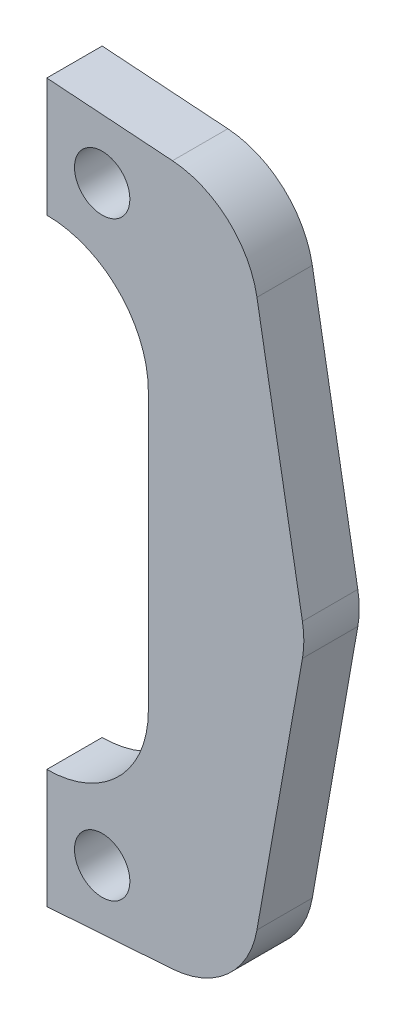
ISO-10303-21;
HEADER;
FILE_DESCRIPTION(('STEP AP214'),'2;1');
FILE_NAME('part.step','',(''),(''),'','','');
FILE_SCHEMA(('AUTOMOTIVE_DESIGN { 1 0 10303 214 1 1 1 1 }'));
ENDSEC;
DATA;
#1=APPLICATION_CONTEXT('core data for automotive mechanical design processes');
#2=APPLICATION_PROTOCOL_DEFINITION('international standard','automotive_design',2000,#1);
#3=PRODUCT_CONTEXT('',#1,'mechanical');
#4=PRODUCT('Part','Part','',(#3));
#5=PRODUCT_RELATED_PRODUCT_CATEGORY('part','',(#4));
#6=PRODUCT_DEFINITION_FORMATION('','',#4);
#7=PRODUCT_DEFINITION_CONTEXT('part definition',#1,'design');
#8=PRODUCT_DEFINITION('design','',#6,#7);
#9=PRODUCT_DEFINITION_SHAPE('','',#8);
#10=(LENGTH_UNIT() NAMED_UNIT(*) SI_UNIT(.MILLI.,.METRE.));
#11=(NAMED_UNIT(*) PLANE_ANGLE_UNIT() SI_UNIT($,.RADIAN.));
#12=(NAMED_UNIT(*) SI_UNIT($,.STERADIAN.) SOLID_ANGLE_UNIT());
#13=UNCERTAINTY_MEASURE_WITH_UNIT(LENGTH_MEASURE(1.E-05),#10,'distance_accuracy_value','');
#14=(GEOMETRIC_REPRESENTATION_CONTEXT(3) GLOBAL_UNCERTAINTY_ASSIGNED_CONTEXT((#13)) GLOBAL_UNIT_ASSIGNED_CONTEXT((#10,
#11,#12)) REPRESENTATION_CONTEXT('',''));
#15=CARTESIAN_POINT('',(0.,0.,0.));
#16=DIRECTION('',(0.,0.,1.));
#17=DIRECTION('',(1.,0.,0.));
#18=AXIS2_PLACEMENT_3D('',#15,#16,#17);
#19=CARTESIAN_POINT('',(89.2258605561517,15.7329265929809,3.));
#20=DIRECTION('',(-0.984807753012208,-0.173648177666932,0.));
#21=DIRECTION('',(0.173648177666932,-0.984807753012208,0.));
#22=AXIS2_PLACEMENT_3D('',#19,#20,#21);
#23=PLANE('',#22);
#24=DIRECTION('',(-0.173648177666932,0.984807753012208,0.));
#25=VECTOR('',#24,1.);
#26=CARTESIAN_POINT('',(89.2258605561517,15.7329265929809,0.));
#27=LINE('',#26,#25);
#28=CARTESIAN_POINT('',(91.8469057056323,0.868240888334657,0.));
#29=VERTEX_POINT('',#28);
#30=CARTESIAN_POINT('',(89.3836489681068,14.8380640409134,0.));
#31=VERTEX_POINT('',#30);
#32=EDGE_CURVE('E160',#29,#31,#27,.T.);
#33=ORIENTED_EDGE('',*,*,#32,.T.);
#34=DIRECTION('',(0.,0.,-1.));
#35=VECTOR('',#34,1.);
#36=CARTESIAN_POINT('',(89.3836489681068,14.8380640409134,3.));
#37=LINE('',#36,#35);
#38=CARTESIAN_POINT('',(89.3836489681068,14.8380640409134,3.));
#39=VERTEX_POINT('',#38);
#40=EDGE_CURVE('E11',#39,#31,#37,.T.);
#41=ORIENTED_EDGE('',*,*,#40,.F.);
#42=DIRECTION('',(-0.173648177666932,0.984807753012208,0.));
#43=VECTOR('',#42,1.);
#44=CARTESIAN_POINT('',(89.2258605561517,15.7329265929809,3.));
#45=LINE('',#44,#43);
#46=CARTESIAN_POINT('',(91.8469057056323,0.868240888334657,3.));
#47=VERTEX_POINT('',#46);
#48=EDGE_CURVE('E253',#47,#39,#45,.T.);
#49=ORIENTED_EDGE('',*,*,#48,.F.);
#50=DIRECTION('',(0.,0.,-1.));
#51=VECTOR('',#50,1.);
#52=CARTESIAN_POINT('',(91.8469057056323,0.868240888334657,3.));
#53=LINE('',#52,#51);
#54=EDGE_CURVE('E150',#47,#29,#53,.T.);
#55=ORIENTED_EDGE('',*,*,#54,.T.);
#56=EDGE_LOOP('',(#33,#41,#49,#55));
#57=FACE_BOUND('',#56,.T.);
#58=ADVANCED_FACE('F33',(#57),#23,.F.);
#59=CARTESIAN_POINT('',(84.4596102030458,13.9698231525787,3.));
#60=DIRECTION('',(0.,0.,-1.));
#61=DIRECTION('',(-1.,0.,0.));
#62=AXIS2_PLACEMENT_3D('',#59,#60,#61);
#63=CYLINDRICAL_SURFACE('',#62,5.);
#64=CARTESIAN_POINT('',(84.4596102030458,13.9698231525787,0.));
#65=DIRECTION('',(0.,0.,1.));
#66=DIRECTION('',(1.,0.,0.));
#67=AXIS2_PLACEMENT_3D('',#64,#65,#66);
#68=CIRCLE('',#67,5.);
#69=CARTESIAN_POINT('',(84.8083925717664,18.9576434038778,0.));
#70=VERTEX_POINT('',#69);
#71=EDGE_CURVE('E163',#31,#70,#68,.T.);
#72=ORIENTED_EDGE('',*,*,#71,.T.);
#73=DIRECTION('',(0.,0.,-1.));
#74=VECTOR('',#73,1.);
#75=CARTESIAN_POINT('',(84.8083925717664,18.9576434038778,3.));
#76=LINE('',#75,#74);
#77=CARTESIAN_POINT('',(84.8083925717664,18.9576434038778,3.));
#78=VERTEX_POINT('',#77);
#79=EDGE_CURVE('E42',#78,#70,#76,.T.);
#80=ORIENTED_EDGE('',*,*,#79,.F.);
#81=CARTESIAN_POINT('',(84.4596102030458,13.9698231525787,3.));
#82=DIRECTION('',(0.,0.,1.));
#83=DIRECTION('',(1.,0.,0.));
#84=AXIS2_PLACEMENT_3D('',#81,#82,#83);
#85=CIRCLE('',#84,5.);
#86=EDGE_CURVE('E105',#39,#78,#85,.T.);
#87=ORIENTED_EDGE('',*,*,#86,.F.);
#88=ORIENTED_EDGE('',*,*,#40,.T.);
#89=EDGE_LOOP('',(#72,#80,#87,#88));
#90=FACE_BOUND('',#89,.T.);
#91=ADVANCED_FACE('F268',(#90),#63,.T.);
#92=CARTESIAN_POINT('',(1.73187173302938,24.7669196534888,3.));
#93=DIRECTION('',(-0.0697564737441186,-0.997564050259825,0.));
#94=DIRECTION('',(0.997564050259825,-0.0697564737441186,0.));
#95=AXIS2_PLACEMENT_3D('',#92,#93,#94);
#96=PLANE('',#95);
#97=DIRECTION('',(-0.997564050259825,0.0697564737441186,0.));
#98=VECTOR('',#97,1.);
#99=CARTESIAN_POINT('',(1.73187173302938,24.7669196534888,0.));
#100=LINE('',#99,#98);
#101=CARTESIAN_POINT('',(78.,19.4337325908813,0.));
#102=VERTEX_POINT('',#101);
#103=EDGE_CURVE('E165',#70,#102,#100,.T.);
#104=ORIENTED_EDGE('',*,*,#103,.T.);
#105=DIRECTION('',(0.,0.,-1.));
#106=VECTOR('',#105,1.);
#107=CARTESIAN_POINT('',(78.,19.4337325908813,3.));
#108=LINE('',#107,#106);
#109=CARTESIAN_POINT('',(78.,19.4337325908813,3.));
#110=VERTEX_POINT('',#109);
#111=EDGE_CURVE('E200',#110,#102,#108,.T.);
#112=ORIENTED_EDGE('',*,*,#111,.F.);
#113=DIRECTION('',(-0.997564050259825,0.0697564737441186,0.));
#114=VECTOR('',#113,1.);
#115=CARTESIAN_POINT('',(1.73187173302938,24.7669196534888,3.));
#116=LINE('',#115,#114);
#117=EDGE_CURVE('E208',#78,#110,#116,.T.);
#118=ORIENTED_EDGE('',*,*,#117,.F.);
#119=ORIENTED_EDGE('',*,*,#79,.T.);
#120=EDGE_LOOP('',(#104,#112,#118,#119));
#121=FACE_BOUND('',#120,.T.);
#122=ADVANCED_FACE('F206',(#121),#96,.F.);
#123=CARTESIAN_POINT('',(78.,0.,3.));
#124=DIRECTION('',(1.,0.,0.));
#125=DIRECTION('',(0.,1.,0.));
#126=AXIS2_PLACEMENT_3D('',#123,#124,#125);
#127=PLANE('',#126);
#128=DIRECTION('',(0.,-1.,0.));
#129=VECTOR('',#128,1.);
#130=CARTESIAN_POINT('',(78.,0.,0.));
#131=LINE('',#130,#129);
#132=CARTESIAN_POINT('',(78.,13.,0.));
#133=VERTEX_POINT('',#132);
#134=EDGE_CURVE('E167',#102,#133,#131,.T.);
#135=ORIENTED_EDGE('',*,*,#134,.T.);
#136=DIRECTION('',(0.,0.,-1.));
#137=VECTOR('',#136,1.);
#138=CARTESIAN_POINT('',(78.,13.,3.));
#139=LINE('',#138,#137);
#140=CARTESIAN_POINT('',(78.,13.,3.));
#141=VERTEX_POINT('',#140);
#142=EDGE_CURVE('E198',#141,#133,#139,.T.);
#143=ORIENTED_EDGE('',*,*,#142,.F.);
#144=DIRECTION('',(0.,-1.,0.));
#145=VECTOR('',#144,1.);
#146=CARTESIAN_POINT('',(78.,0.,3.));
#147=LINE('',#146,#145);
#148=EDGE_CURVE('E219',#110,#141,#147,.T.);
#149=ORIENTED_EDGE('',*,*,#148,.F.);
#150=ORIENTED_EDGE('',*,*,#111,.T.);
#151=EDGE_LOOP('',(#135,#143,#149,#150));
#152=FACE_BOUND('',#151,.T.);
#153=ADVANCED_FACE('F216',(#152),#127,.F.);
#154=CARTESIAN_POINT('',(78.,7.5,3.));
#155=DIRECTION('',(0.,0.,-1.));
#156=DIRECTION('',(-1.,0.,0.));
#157=AXIS2_PLACEMENT_3D('',#154,#155,#156);
#158=CYLINDRICAL_SURFACE('',#157,5.50000000000001);
#159=CARTESIAN_POINT('',(78.,7.5,0.));
#160=DIRECTION('',(0.,0.,1.));
#161=DIRECTION('',(1.,0.,0.));
#162=AXIS2_PLACEMENT_3D('',#159,#160,#161);
#163=CIRCLE('',#162,5.50000000000001);
#164=CARTESIAN_POINT('',(83.5,7.5,0.));
#165=VERTEX_POINT('',#164);
#166=EDGE_CURVE('E170',#165,#133,#163,.T.);
#167=ORIENTED_EDGE('',*,*,#166,.F.);
#168=DIRECTION('',(0.,0.,-1.));
#169=VECTOR('',#168,1.);
#170=CARTESIAN_POINT('',(83.5,7.5,3.));
#171=LINE('',#170,#169);
#172=CARTESIAN_POINT('',(83.5,7.5,3.));
#173=VERTEX_POINT('',#172);
#174=EDGE_CURVE('E196',#173,#165,#171,.T.);
#175=ORIENTED_EDGE('',*,*,#174,.F.);
#176=CARTESIAN_POINT('',(78.,7.5,3.));
#177=DIRECTION('',(0.,0.,1.));
#178=DIRECTION('',(1.,0.,0.));
#179=AXIS2_PLACEMENT_3D('',#176,#177,#178);
#180=CIRCLE('',#179,5.50000000000001);
#181=EDGE_CURVE('E221',#173,#141,#180,.T.);
#182=ORIENTED_EDGE('',*,*,#181,.T.);
#183=ORIENTED_EDGE('',*,*,#142,.T.);
#184=EDGE_LOOP('',(#167,#175,#182,#183));
#185=FACE_BOUND('',#184,.T.);
#186=ADVANCED_FACE('F241',(#185),#158,.F.);
#187=CARTESIAN_POINT('',(83.5,0.,3.));
#188=DIRECTION('',(-1.,0.,0.));
#189=DIRECTION('',(0.,0.,1.));
#190=AXIS2_PLACEMENT_3D('',#187,#188,#189);
#191=PLANE('',#190);
#192=DIRECTION('',(0.,1.,0.));
#193=VECTOR('',#192,1.);
#194=CARTESIAN_POINT('',(83.5,0.,0.));
#195=LINE('',#194,#193);
#196=CARTESIAN_POINT('',(83.5,-7.5,0.));
#197=VERTEX_POINT('',#196);
#198=EDGE_CURVE('E174',#197,#165,#195,.T.);
#199=ORIENTED_EDGE('',*,*,#198,.F.);
#200=DIRECTION('',(0.,0.,-1.));
#201=VECTOR('',#200,1.);
#202=CARTESIAN_POINT('',(83.5,-7.5,3.));
#203=LINE('',#202,#201);
#204=CARTESIAN_POINT('',(83.5,-7.5,3.));
#205=VERTEX_POINT('',#204);
#206=EDGE_CURVE('E194',#205,#197,#203,.T.);
#207=ORIENTED_EDGE('',*,*,#206,.F.);
#208=DIRECTION('',(0.,1.,0.));
#209=VECTOR('',#208,1.);
#210=CARTESIAN_POINT('',(83.5,0.,3.));
#211=LINE('',#210,#209);
#212=EDGE_CURVE('E224',#205,#173,#211,.T.);
#213=ORIENTED_EDGE('',*,*,#212,.T.);
#214=ORIENTED_EDGE('',*,*,#174,.T.);
#215=EDGE_LOOP('',(#199,#207,#213,#214));
#216=FACE_BOUND('',#215,.T.);
#217=ADVANCED_FACE('F239',(#216),#191,.T.);
#218=CARTESIAN_POINT('',(78.,-7.5,3.));
#219=DIRECTION('',(0.,0.,-1.));
#220=DIRECTION('',(-1.,0.,0.));
#221=AXIS2_PLACEMENT_3D('',#218,#219,#220);
#222=CYLINDRICAL_SURFACE('',#221,5.50000000000001);
#223=CARTESIAN_POINT('',(78.,-7.5,0.));
#224=DIRECTION('',(0.,0.,1.));
#225=DIRECTION('',(1.,0.,0.));
#226=AXIS2_PLACEMENT_3D('',#223,#224,#225);
#227=CIRCLE('',#226,5.50000000000001);
#228=CARTESIAN_POINT('',(78.,-13.,0.));
#229=VERTEX_POINT('',#228);
#230=EDGE_CURVE('E177',#229,#197,#227,.T.);
#231=ORIENTED_EDGE('',*,*,#230,.F.);
#232=DIRECTION('',(0.,0.,-1.));
#233=VECTOR('',#232,1.);
#234=CARTESIAN_POINT('',(78.,-13.,3.));
#235=LINE('',#234,#233);
#236=CARTESIAN_POINT('',(78.,-13.,3.));
#237=VERTEX_POINT('',#236);
#238=EDGE_CURVE('E192',#237,#229,#235,.T.);
#239=ORIENTED_EDGE('',*,*,#238,.F.);
#240=CARTESIAN_POINT('',(78.,-7.5,3.));
#241=DIRECTION('',(0.,0.,1.));
#242=DIRECTION('',(1.,0.,0.));
#243=AXIS2_PLACEMENT_3D('',#240,#241,#242);
#244=CIRCLE('',#243,5.50000000000001);
#245=EDGE_CURVE('E227',#237,#205,#244,.T.);
#246=ORIENTED_EDGE('',*,*,#245,.T.);
#247=ORIENTED_EDGE('',*,*,#206,.T.);
#248=EDGE_LOOP('',(#231,#239,#246,#247));
#249=FACE_BOUND('',#248,.T.);
#250=ADVANCED_FACE('F245',(#249),#222,.F.);
#251=CARTESIAN_POINT('',(78.,-19.4337325908813,0.));
#252=VERTEX_POINT('',#251);
#253=EDGE_CURVE('E171',#229,#252,#131,.T.);
#254=ORIENTED_EDGE('',*,*,#253,.T.);
#255=DIRECTION('',(0.,0.,-1.));
#256=VECTOR('',#255,1.);
#257=CARTESIAN_POINT('',(78.,-19.4337325908813,3.));
#258=LINE('',#257,#256);
#259=CARTESIAN_POINT('',(78.,-19.4337325908813,3.));
#260=VERTEX_POINT('',#259);
#261=EDGE_CURVE('E189',#260,#252,#258,.T.);
#262=ORIENTED_EDGE('',*,*,#261,.F.);
#263=EDGE_CURVE('E223',#237,#260,#147,.T.);
#264=ORIENTED_EDGE('',*,*,#263,.F.);
#265=ORIENTED_EDGE('',*,*,#238,.T.);
#266=EDGE_LOOP('',(#254,#262,#264,#265));
#267=FACE_BOUND('',#266,.T.);
#268=ADVANCED_FACE('F247',(#267),#127,.F.);
#269=CARTESIAN_POINT('',(1.73187173302938,-24.7669196534888,3.));
#270=DIRECTION('',(-0.0697564737441189,0.997564050259825,0.));
#271=DIRECTION('',(-0.997564050259825,-0.0697564737441189,0.));
#272=AXIS2_PLACEMENT_3D('',#269,#270,#271);
#273=PLANE('',#272);
#274=DIRECTION('',(0.997564050259825,0.0697564737441189,0.));
#275=VECTOR('',#274,1.);
#276=CARTESIAN_POINT('',(1.73187173302938,-24.7669196534888,0.));
#277=LINE('',#276,#275);
#278=CARTESIAN_POINT('',(84.8083925717664,-18.9576434038778,0.));
#279=VERTEX_POINT('',#278);
#280=EDGE_CURVE('E180',#252,#279,#277,.T.);
#281=ORIENTED_EDGE('',*,*,#280,.T.);
#282=DIRECTION('',(0.,0.,-1.));
#283=VECTOR('',#282,1.);
#284=CARTESIAN_POINT('',(84.8083925717664,-18.9576434038778,3.));
#285=LINE('',#284,#283);
#286=CARTESIAN_POINT('',(84.8083925717664,-18.9576434038778,3.));
#287=VERTEX_POINT('',#286);
#288=EDGE_CURVE('E145',#287,#279,#285,.T.);
#289=ORIENTED_EDGE('',*,*,#288,.F.);
#290=DIRECTION('',(0.997564050259825,0.0697564737441189,0.));
#291=VECTOR('',#290,1.);
#292=CARTESIAN_POINT('',(1.73187173302938,-24.7669196534888,3.));
#293=LINE('',#292,#291);
#294=EDGE_CURVE('E136',#260,#287,#293,.T.);
#295=ORIENTED_EDGE('',*,*,#294,.F.);
#296=ORIENTED_EDGE('',*,*,#261,.T.);
#297=EDGE_LOOP('',(#281,#289,#295,#296));
#298=FACE_BOUND('',#297,.T.);
#299=ADVANCED_FACE('F249',(#298),#273,.F.);
#300=CARTESIAN_POINT('',(84.4596102030458,-13.9698231525787,3.));
#301=DIRECTION('',(0.,0.,-1.));
#302=DIRECTION('',(-1.,0.,0.));
#303=AXIS2_PLACEMENT_3D('',#300,#301,#302);
#304=CYLINDRICAL_SURFACE('',#303,4.99999999999999);
#305=CARTESIAN_POINT('',(84.4596102030458,-13.9698231525787,0.));
#306=DIRECTION('',(0.,0.,1.));
#307=DIRECTION('',(1.,0.,0.));
#308=AXIS2_PLACEMENT_3D('',#305,#306,#307);
#309=CIRCLE('',#308,4.99999999999999);
#310=CARTESIAN_POINT('',(89.3836489681068,-14.8380640409134,0.));
#311=VERTEX_POINT('',#310);
#312=EDGE_CURVE('E144',#279,#311,#309,.T.);
#313=ORIENTED_EDGE('',*,*,#312,.T.);
#314=DIRECTION('',(0.,0.,-1.));
#315=VECTOR('',#314,1.);
#316=CARTESIAN_POINT('',(89.3836489681068,-14.8380640409134,3.));
#317=LINE('',#316,#315);
#318=CARTESIAN_POINT('',(89.3836489681068,-14.8380640409134,3.));
#319=VERTEX_POINT('',#318);
#320=EDGE_CURVE('E141',#319,#311,#317,.T.);
#321=ORIENTED_EDGE('',*,*,#320,.F.);
#322=CARTESIAN_POINT('',(84.4596102030458,-13.9698231525787,3.));
#323=DIRECTION('',(0.,0.,1.));
#324=DIRECTION('',(1.,0.,0.));
#325=AXIS2_PLACEMENT_3D('',#322,#323,#324);
#326=CIRCLE('',#325,4.99999999999999);
#327=EDGE_CURVE('E130',#287,#319,#326,.T.);
#328=ORIENTED_EDGE('',*,*,#327,.F.);
#329=ORIENTED_EDGE('',*,*,#288,.T.);
#330=EDGE_LOOP('',(#313,#321,#328,#329));
#331=FACE_BOUND('',#330,.T.);
#332=ADVANCED_FACE('F142',(#331),#304,.T.);
#333=CARTESIAN_POINT('',(89.2258605561517,-15.7329265929811,3.));
#334=DIRECTION('',(-0.984807753012207,0.173648177666934,0.));
#335=DIRECTION('',(-0.173648177666934,-0.984807753012208,0.));
#336=AXIS2_PLACEMENT_3D('',#333,#334,#335);
#337=PLANE('',#336);
#338=DIRECTION('',(0.173648177666934,0.984807753012208,0.));
#339=VECTOR('',#338,1.);
#340=CARTESIAN_POINT('',(89.2258605561517,-15.7329265929811,0.));
#341=LINE('',#340,#339);
#342=CARTESIAN_POINT('',(91.8469057056323,-0.868240888334678,0.));
#343=VERTEX_POINT('',#342);
#344=EDGE_CURVE('E91',#311,#343,#341,.T.);
#345=ORIENTED_EDGE('',*,*,#344,.T.);
#346=DIRECTION('',(0.,0.,-1.));
#347=VECTOR('',#346,1.);
#348=CARTESIAN_POINT('',(91.8469057056323,-0.868240888334678,3.));
#349=LINE('',#348,#347);
#350=CARTESIAN_POINT('',(91.8469057056323,-0.868240888334678,3.));
#351=VERTEX_POINT('',#350);
#352=EDGE_CURVE('E146',#351,#343,#349,.T.);
#353=ORIENTED_EDGE('',*,*,#352,.F.);
#354=DIRECTION('',(0.173648177666934,0.984807753012208,0.));
#355=VECTOR('',#354,1.);
#356=CARTESIAN_POINT('',(89.2258605561517,-15.7329265929811,3.));
#357=LINE('',#356,#355);
#358=EDGE_CURVE('E134',#319,#351,#357,.T.);
#359=ORIENTED_EDGE('',*,*,#358,.F.);
#360=ORIENTED_EDGE('',*,*,#320,.T.);
#361=EDGE_LOOP('',(#345,#353,#359,#360));
#362=FACE_BOUND('',#361,.T.);
#363=ADVANCED_FACE('F148',(#362),#337,.F.);
#364=CARTESIAN_POINT('',(81.,16.,3.));
#365=DIRECTION('',(0.,0.,-1.));
#366=DIRECTION('',(-1.,0.,0.));
#367=AXIS2_PLACEMENT_3D('',#364,#365,#366);
#368=CYLINDRICAL_SURFACE('',#367,1.5);
#369=CARTESIAN_POINT('',(81.,16.,3.));
#370=DIRECTION('',(0.,0.,1.));
#371=DIRECTION('',(1.,0.,0.));
#372=AXIS2_PLACEMENT_3D('',#369,#370,#371);
#373=CIRCLE('',#372,1.5);
#374=CARTESIAN_POINT('',(82.5,16.,3.));
#375=VERTEX_POINT('',#374);
#376=EDGE_CURVE('E283',#375,#375,#373,.T.);
#377=ORIENTED_EDGE('',*,*,#376,.T.);
#378=EDGE_LOOP('',(#377));
#379=FACE_BOUND('',#378,.T.);
#380=CARTESIAN_POINT('',(81.,16.,0.));
#381=DIRECTION('',(0.,0.,1.));
#382=DIRECTION('',(1.,0.,0.));
#383=AXIS2_PLACEMENT_3D('',#380,#381,#382);
#384=CIRCLE('',#383,1.5);
#385=CARTESIAN_POINT('',(82.5,16.,0.));
#386=VERTEX_POINT('',#385);
#387=EDGE_CURVE('E157',#386,#386,#384,.T.);
#388=ORIENTED_EDGE('',*,*,#387,.F.);
#389=EDGE_LOOP('',(#388));
#390=FACE_BOUND('',#389,.T.);
#391=ADVANCED_FACE('F263',(#379,#390),#368,.F.);
#392=CARTESIAN_POINT('',(81.,-16.,3.));
#393=DIRECTION('',(0.,0.,-1.));
#394=DIRECTION('',(-1.,0.,0.));
#395=AXIS2_PLACEMENT_3D('',#392,#393,#394);
#396=CYLINDRICAL_SURFACE('',#395,1.5);
#397=CARTESIAN_POINT('',(81.,-16.,3.));
#398=DIRECTION('',(0.,0.,1.));
#399=DIRECTION('',(1.,0.,0.));
#400=AXIS2_PLACEMENT_3D('',#397,#398,#399);
#401=CIRCLE('',#400,1.5);
#402=CARTESIAN_POINT('',(82.5,-16.,3.));
#403=VERTEX_POINT('',#402);
#404=EDGE_CURVE('E185',#403,#403,#401,.T.);
#405=ORIENTED_EDGE('',*,*,#404,.T.);
#406=EDGE_LOOP('',(#405));
#407=FACE_BOUND('',#406,.T.);
#408=CARTESIAN_POINT('',(81.,-16.,0.));
#409=DIRECTION('',(0.,0.,1.));
#410=DIRECTION('',(1.,0.,0.));
#411=AXIS2_PLACEMENT_3D('',#408,#409,#410);
#412=CIRCLE('',#411,1.5);
#413=CARTESIAN_POINT('',(82.5,-16.,0.));
#414=VERTEX_POINT('',#413);
#415=EDGE_CURVE('E154',#414,#414,#412,.T.);
#416=ORIENTED_EDGE('',*,*,#415,.F.);
#417=EDGE_LOOP('',(#416));
#418=FACE_BOUND('',#417,.T.);
#419=ADVANCED_FACE('F35',(#407,#418),#396,.F.);
#420=CARTESIAN_POINT('',(86.9228669405713,0.,3.));
#421=DIRECTION('',(0.,0.,-1.));
#422=DIRECTION('',(-1.,0.,0.));
#423=AXIS2_PLACEMENT_3D('',#420,#421,#422);
#424=CYLINDRICAL_SURFACE('',#423,4.99999999999999);
#425=CARTESIAN_POINT('',(86.9228669405713,0.,0.));
#426=DIRECTION('',(0.,0.,1.));
#427=DIRECTION('',(1.,0.,0.));
#428=AXIS2_PLACEMENT_3D('',#425,#426,#427);
#429=CIRCLE('',#428,4.99999999999999);
#430=EDGE_CURVE('E97',#343,#29,#429,.T.);
#431=ORIENTED_EDGE('',*,*,#430,.T.);
#432=ORIENTED_EDGE('',*,*,#54,.F.);
#433=CARTESIAN_POINT('',(86.9228669405713,0.,3.));
#434=DIRECTION('',(0.,0.,1.));
#435=DIRECTION('',(1.,0.,0.));
#436=AXIS2_PLACEMENT_3D('',#433,#434,#435);
#437=CIRCLE('',#436,4.99999999999999);
#438=EDGE_CURVE('E50',#351,#47,#437,.T.);
#439=ORIENTED_EDGE('',*,*,#438,.F.);
#440=ORIENTED_EDGE('',*,*,#352,.T.);
#441=EDGE_LOOP('',(#431,#432,#439,#440));
#442=FACE_BOUND('',#441,.T.);
#443=ADVANCED_FACE('F254',(#442),#424,.T.);
#444=CARTESIAN_POINT('',(0.,0.,3.));
#445=DIRECTION('',(0.,0.,1.));
#446=DIRECTION('',(1.,0.,0.));
#447=AXIS2_PLACEMENT_3D('',#444,#445,#446);
#448=PLANE('',#447);
#449=ORIENTED_EDGE('',*,*,#404,.F.);
#450=EDGE_LOOP('',(#449));
#451=FACE_BOUND('',#450,.T.);
#452=ORIENTED_EDGE('',*,*,#376,.F.);
#453=EDGE_LOOP('',(#452));
#454=FACE_BOUND('',#453,.T.);
#455=ORIENTED_EDGE('',*,*,#48,.T.);
#456=ORIENTED_EDGE('',*,*,#86,.T.);
#457=ORIENTED_EDGE('',*,*,#117,.T.);
#458=ORIENTED_EDGE('',*,*,#148,.T.);
#459=ORIENTED_EDGE('',*,*,#181,.F.);
#460=ORIENTED_EDGE('',*,*,#212,.F.);
#461=ORIENTED_EDGE('',*,*,#245,.F.);
#462=ORIENTED_EDGE('',*,*,#263,.T.);
#463=ORIENTED_EDGE('',*,*,#294,.T.);
#464=ORIENTED_EDGE('',*,*,#327,.T.);
#465=ORIENTED_EDGE('',*,*,#358,.T.);
#466=ORIENTED_EDGE('',*,*,#438,.T.);
#467=EDGE_LOOP('',(#455,#456,#457,#458,#459,#460,#461,#462,#463,#464,#465,#466));
#468=FACE_BOUND('',#467,.T.);
#469=ADVANCED_FACE('F132',(#451,#454,#468),#448,.T.);
#470=CARTESIAN_POINT('',(0.,0.,0.));
#471=DIRECTION('',(0.,0.,1.));
#472=DIRECTION('',(1.,0.,0.));
#473=AXIS2_PLACEMENT_3D('',#470,#471,#472);
#474=PLANE('',#473);
#475=ORIENTED_EDGE('',*,*,#415,.T.);
#476=EDGE_LOOP('',(#475));
#477=FACE_BOUND('',#476,.T.);
#478=ORIENTED_EDGE('',*,*,#387,.T.);
#479=EDGE_LOOP('',(#478));
#480=FACE_BOUND('',#479,.T.);
#481=ORIENTED_EDGE('',*,*,#32,.F.);
#482=ORIENTED_EDGE('',*,*,#430,.F.);
#483=ORIENTED_EDGE('',*,*,#344,.F.);
#484=ORIENTED_EDGE('',*,*,#312,.F.);
#485=ORIENTED_EDGE('',*,*,#280,.F.);
#486=ORIENTED_EDGE('',*,*,#253,.F.);
#487=ORIENTED_EDGE('',*,*,#230,.T.);
#488=ORIENTED_EDGE('',*,*,#198,.T.);
#489=ORIENTED_EDGE('',*,*,#166,.T.);
#490=ORIENTED_EDGE('',*,*,#134,.F.);
#491=ORIENTED_EDGE('',*,*,#103,.F.);
#492=ORIENTED_EDGE('',*,*,#71,.F.);
#493=EDGE_LOOP('',(#481,#482,#483,#484,#485,#486,#487,#488,#489,#490,#491,#492));
#494=FACE_BOUND('',#493,.T.);
#495=ADVANCED_FACE('F212',(#477,#480,#494),#474,.F.);
#496=CLOSED_SHELL('',(#58,#91,#122,#153,#186,#217,#250,#268,#299,#332,#363,#391,#419,#443,#469,#495));
#497=MANIFOLD_SOLID_BREP('B2',#496);
#498=ADVANCED_BREP_SHAPE_REPRESENTATION('',(#18,#497),#14);
#499=SHAPE_DEFINITION_REPRESENTATION(#9,#498);
ENDSEC;
END-ISO-10303-21;
